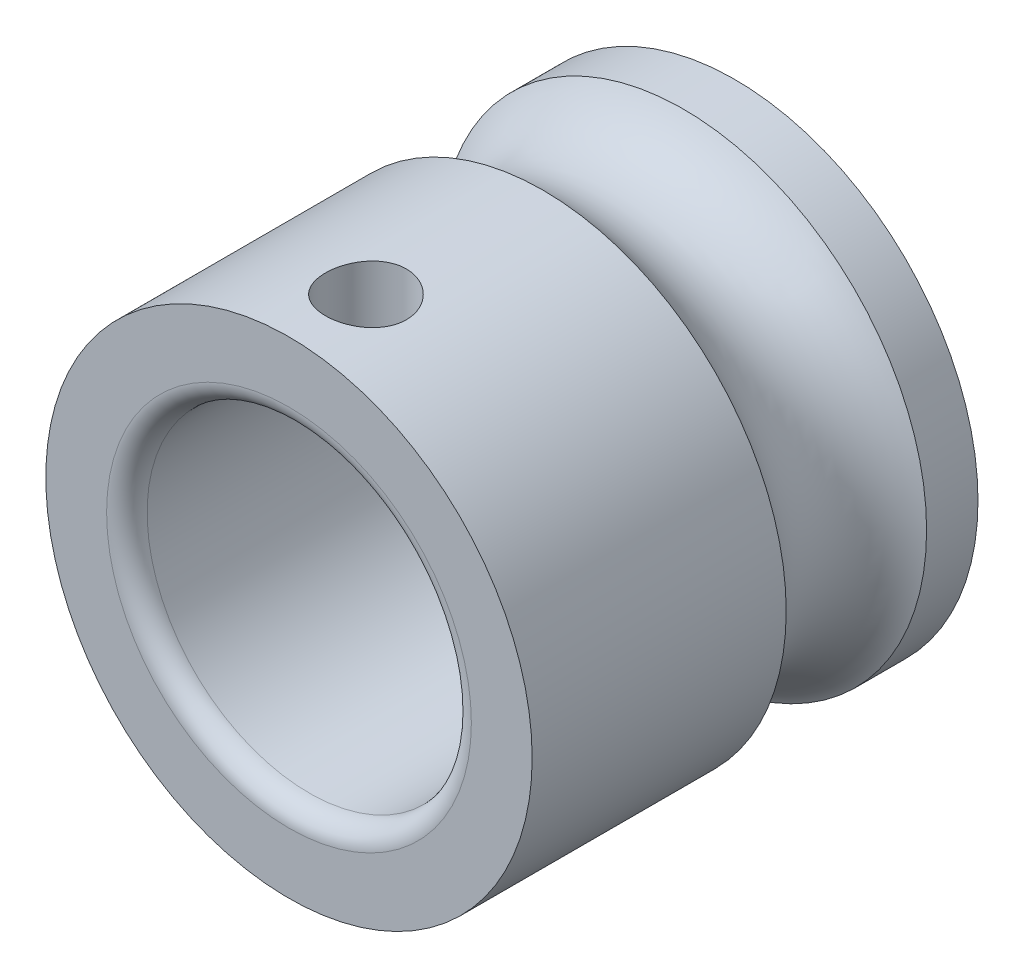
ISO-10303-21;
HEADER;
FILE_DESCRIPTION(('STEP AP214'),'2;1');
FILE_NAME('part.step','',(''),(''),'','','');
FILE_SCHEMA(('AUTOMOTIVE_DESIGN { 1 0 10303 214 1 1 1 1 }'));
ENDSEC;
DATA;
#1=APPLICATION_CONTEXT('core data for automotive mechanical design processes');
#2=APPLICATION_PROTOCOL_DEFINITION('international standard','automotive_design',2000,#1);
#3=PRODUCT_CONTEXT('',#1,'mechanical');
#4=PRODUCT('Part','Part','',(#3));
#5=PRODUCT_RELATED_PRODUCT_CATEGORY('part','',(#4));
#6=PRODUCT_DEFINITION_FORMATION('','',#4);
#7=PRODUCT_DEFINITION_CONTEXT('part definition',#1,'design');
#8=PRODUCT_DEFINITION('design','',#6,#7);
#9=PRODUCT_DEFINITION_SHAPE('','',#8);
#10=(LENGTH_UNIT() NAMED_UNIT(*) SI_UNIT(.MILLI.,.METRE.));
#11=(NAMED_UNIT(*) PLANE_ANGLE_UNIT() SI_UNIT($,.RADIAN.));
#12=(NAMED_UNIT(*) SI_UNIT($,.STERADIAN.) SOLID_ANGLE_UNIT());
#13=UNCERTAINTY_MEASURE_WITH_UNIT(LENGTH_MEASURE(1.E-05),#10,'distance_accuracy_value','');
#14=(GEOMETRIC_REPRESENTATION_CONTEXT(3) GLOBAL_UNCERTAINTY_ASSIGNED_CONTEXT((#13)) GLOBAL_UNIT_ASSIGNED_CONTEXT((#10,
#11,#12)) REPRESENTATION_CONTEXT('',''));
#15=CARTESIAN_POINT('',(0.,0.,0.));
#16=DIRECTION('',(0.,0.,1.));
#17=DIRECTION('',(1.,0.,0.));
#18=AXIS2_PLACEMENT_3D('',#15,#16,#17);
#19=CARTESIAN_POINT('',(0.,0.,-3.));
#20=DIRECTION('',(0.,0.,1.));
#21=DIRECTION('',(1.,0.,0.));
#22=AXIS2_PLACEMENT_3D('',#19,#20,#21);
#23=CYLINDRICAL_SURFACE('',#22,6.);
#24=CARTESIAN_POINT('',(0.,0.,1.73205080756888));
#25=DIRECTION('',(0.,0.,-1.));
#26=DIRECTION('',(-1.,0.,0.));
#27=AXIS2_PLACEMENT_3D('',#24,#25,#26);
#28=CIRCLE('',#27,6.);
#29=CARTESIAN_POINT('',(-6.,0.,1.73205080756888));
#30=VERTEX_POINT('',#29);
#31=EDGE_CURVE('E72',#30,#30,#28,.T.);
#32=ORIENTED_EDGE('',*,*,#31,.F.);
#33=EDGE_LOOP('',(#32));
#34=FACE_BOUND('',#33,.T.);
#35=CARTESIAN_POINT('',(0.,0.,8.));
#36=DIRECTION('',(0.,0.,1.));
#37=DIRECTION('',(1.,0.,0.));
#38=AXIS2_PLACEMENT_3D('',#35,#36,#37);
#39=CIRCLE('',#38,6.);
#40=CARTESIAN_POINT('',(6.,0.,8.));
#41=VERTEX_POINT('',#40);
#42=EDGE_CURVE('E71',#41,#41,#39,.T.);
#43=ORIENTED_EDGE('',*,*,#42,.F.);
#44=EDGE_LOOP('',(#43));
#45=FACE_BOUND('',#44,.T.);
#46=CARTESIAN_POINT('',(0.,6.,5.10102588848349));
#47=CARTESIAN_POINT('',(0.0557563619832859,5.9999990446753,5.10102812406262));
#48=CARTESIAN_POINT('',(0.111543152735528,5.99921471165214,5.10570479847106));
#49=CARTESIAN_POINT('',(0.221552088669217,5.99616137976555,5.12428015198962));
#50=CARTESIAN_POINT('',(0.275772747183699,5.99389101569556,5.13818731124813));
#51=CARTESIAN_POINT('',(0.381041898885057,5.9881202729458,5.17479206792059));
#52=CARTESIAN_POINT('',(0.43209294737276,5.98462090063677,5.19748247473972));
#53=CARTESIAN_POINT('',(0.529656736791178,5.97677690832828,5.25099080530445));
#54=CARTESIAN_POINT('',(0.576169995951436,5.97243238501774,5.28180779947669));
#55=CARTESIAN_POINT('',(0.663789045716672,5.96333326983325,5.35100792201167));
#56=CARTESIAN_POINT('',(0.704845161413987,5.95857548725943,5.38945353433794));
#57=CARTESIAN_POINT('',(0.779955399463971,5.94921050750693,5.47268507587262));
#58=CARTESIAN_POINT('',(0.814009079756388,5.94460331985067,5.51747140506614));
#59=CARTESIAN_POINT('',(0.874346850242053,5.93603026303912,5.61245427496231));
#60=CARTESIAN_POINT('',(0.900581821144401,5.93206851636655,5.66268242320539));
#61=CARTESIAN_POINT('',(0.944223346164488,5.9252791591787,5.76690971420374));
#62=CARTESIAN_POINT('',(0.961630496626245,5.92245147205723,5.82090860195454));
#63=CARTESIAN_POINT('',(0.986965751113923,5.91828214737102,5.93061799842611));
#64=CARTESIAN_POINT('',(0.994979611654161,5.9169270739428,5.98630818308405));
#65=CARTESIAN_POINT('',(1.00156669011595,5.9158157557466,6.09825799923688));
#66=CARTESIAN_POINT('',(1.0001405761556,5.91605939782886,6.15451759015041));
#67=CARTESIAN_POINT('',(0.987958039358461,5.91810571545422,6.26539703299367));
#68=CARTESIAN_POINT('',(0.977297952755909,5.91989229327567,6.32002780990158));
#69=CARTESIAN_POINT('',(0.947101256161378,5.92479798084403,6.42671441561514));
#70=CARTESIAN_POINT('',(0.927564341727896,5.92791713629309,6.47877015603891));
#71=CARTESIAN_POINT('',(0.880070898437565,5.9351539173364,6.57911741785986));
#72=CARTESIAN_POINT('',(0.852074365551886,5.9392762684293,6.62738965091598));
#73=CARTESIAN_POINT('',(0.788484807022974,5.94805167366004,6.71858764869884));
#74=CARTESIAN_POINT('',(0.752891168261716,5.95270477061714,6.76151298146546));
#75=CARTESIAN_POINT('',(0.674592884863622,5.96208811151914,6.84135632280643));
#76=CARTESIAN_POINT('',(0.631805585549251,5.96681859692661,6.87819329589952));
#77=CARTESIAN_POINT('',(0.540614099592659,5.97577040558689,6.94417699354963));
#78=CARTESIAN_POINT('',(0.492209876762569,5.97999172555898,6.97332366855678));
#79=CARTESIAN_POINT('',(0.391082366466685,5.98745557157165,7.023106779338));
#80=CARTESIAN_POINT('',(0.338355490225865,5.99069727362979,7.04373605621599));
#81=CARTESIAN_POINT('',(0.230119338241093,5.99583001205064,7.07582357458188));
#82=CARTESIAN_POINT('',(0.174610295671788,5.9977211614019,7.08728258327298));
#83=CARTESIAN_POINT('',(0.0630839605206498,5.99992451937074,7.10059443186794));
#84=CARTESIAN_POINT('',(0.0070802948604048,6.00025501205114,7.10255851720573));
#85=CARTESIAN_POINT('',(-0.104455909155955,5.99934989768468,7.09712135071224));
#86=CARTESIAN_POINT('',(-0.159988465556815,5.99811435089647,7.08972045923));
#87=CARTESIAN_POINT('',(-0.268662470218705,5.99422730775281,7.0658559487493));
#88=CARTESIAN_POINT('',(-0.321816347354152,5.99158441920524,7.04944740512744));
#89=CARTESIAN_POINT('',(-0.424618753944177,5.98517785782144,7.00809208120368));
#90=CARTESIAN_POINT('',(-0.474267086363888,5.98141412204808,6.98314482142938));
#91=CARTESIAN_POINT('',(-0.569132275787583,5.97313806520963,6.92516543860478));
#92=CARTESIAN_POINT('',(-0.614306100374859,5.96861942354809,6.89206382601659));
#93=CARTESIAN_POINT('',(-0.698497434201075,5.9593538695676,6.81881096232947));
#94=CARTESIAN_POINT('',(-0.737514495878633,5.95460694068619,6.77865919917282));
#95=CARTESIAN_POINT('',(-0.8086971118632,5.94536070094338,6.69194686925492));
#96=CARTESIAN_POINT('',(-0.840787504445486,5.94086446454842,6.64532422227773));
#97=CARTESIAN_POINT('',(-0.896680924117994,5.93268611911154,6.54728470082808));
#98=CARTESIAN_POINT('',(-0.920484213907929,5.92900398426408,6.49586797839249));
#99=CARTESIAN_POINT('',(-0.95901533258926,5.92289381479082,6.38990999535864));
#100=CARTESIAN_POINT('',(-0.973780573019178,5.92046061724426,6.3353826504713));
#101=CARTESIAN_POINT('',(-0.993934181511311,5.91711086734105,6.22457783679479));
#102=CARTESIAN_POINT('',(-0.999323364778467,5.91619418313089,6.16830052059067));
#103=CARTESIAN_POINT('',(-1.00054914641894,5.91598693233605,6.05634382209853));
#104=CARTESIAN_POINT('',(-0.996504054450075,5.9166762260226,6.00066573705338));
#105=CARTESIAN_POINT('',(-0.979231935582739,5.91955912581491,5.89079418926318));
#106=CARTESIAN_POINT('',(-0.966004938444991,5.92175272704486,5.83660072170674));
#107=CARTESIAN_POINT('',(-0.930789795837961,5.92738942512688,5.73128251356645));
#108=CARTESIAN_POINT('',(-0.908811836240177,5.93083106887868,5.68015428446108));
#109=CARTESIAN_POINT('',(-0.856730801566363,5.93857747568883,5.58229162080555));
#110=CARTESIAN_POINT('',(-0.826627323499425,5.9428822815536,5.53555740433464));
#111=CARTESIAN_POINT('',(-0.758727553748862,5.95193381618249,5.44721165524039));
#112=CARTESIAN_POINT('',(-0.72084422543746,5.95668518230521,5.40566748180338));
#113=CARTESIAN_POINT('',(-0.638643612552093,5.96605748944336,5.32948524669352));
#114=CARTESIAN_POINT('',(-0.594324845165055,5.97067840010619,5.29484878102822));
#115=CARTESIAN_POINT('',(-0.500147667856113,5.97930611856888,5.23324658120351));
#116=CARTESIAN_POINT('',(-0.450253115013128,5.98330846501242,5.20633547275831));
#117=CARTESIAN_POINT('',(-0.346605227751593,5.9902046704071,5.16131809463952));
#118=CARTESIAN_POINT('',(-0.292855797932004,5.99309963270993,5.14320305605161));
#119=CARTESIAN_POINT('',(-0.19908132401816,5.99682316333182,5.12022377883283));
#120=CARTESIAN_POINT('',(-0.159623532119379,5.99800810909344,5.11303610063711));
#121=CARTESIAN_POINT('',(-0.0801157241279235,5.99959686394448,5.10343639334559));
#122=CARTESIAN_POINT('',(-0.0400657182433976,6.00000068648257,5.10102428202855));
#123=CARTESIAN_POINT('',(0.,6.,5.10102588848349));
#124=B_SPLINE_CURVE_WITH_KNOTS('',3,(#46,#47,#48,#49,#50,#51,#52,#53,#54,#55,#56,#57,#58,#59,
#60,#61,#62,#63,#64,#65,#66,#67,#68,#69,#70,#71,#72,#73,#74,#75,#76,#77,#78,#79,#80,#81,#82,#83,
#84,#85,#86,#87,#88,#89,#90,#91,#92,#93,#94,#95,#96,#97,#98,#99,#100,#101,#102,#103,#104,#105,
#106,#107,#108,#109,#110,#111,#112,#113,#114,#115,#116,#117,#118,#119,#120,#121,#122,#123),
.UNSPECIFIED.,.T.,.F.,(4,2,2,2,2,2,2,2,2,2,2,2,2,2,2,2,2,2,2,2,2,2,2,2,2,2,2,2,2,2,2,2,2,2,2,2,
2,2,4),(0.,0.167122633975404,0.334399018278168,0.501538746810108,0.668659365069916,
0.837209964249328,1.00577120067943,1.17537008329536,1.34495750750472,1.51298430841369,
1.68099921728354,1.84728208704163,2.01357066010152,2.18065822653023,2.34775928272229,
2.51693107964531,2.68610396654339,2.85541875566361,3.0247193780846,3.19203153396559,
3.35933725214344,3.52563122802566,3.69193454330427,3.8597073025081,4.02749225221713,
4.19701528803048,4.36653294950377,4.53534408936709,4.70414055114647,4.8708316380908,
5.03752218475253,5.20401927290489,5.37052462011734,5.53900553677357,5.70752533551589,
5.8772089264288,6.04672300852029,6.16681699265607,6.28690890910787),.UNSPECIFIED.);
#125=CARTESIAN_POINT('',(0.,6.,5.10102588848349));
#126=VERTEX_POINT('',#125);
#127=EDGE_CURVE('E76',#126,#126,#124,.T.);
#128=ORIENTED_EDGE('',*,*,#127,.T.);
#129=EDGE_LOOP('',(#128));
#130=FACE_BOUND('',#129,.T.);
#131=ADVANCED_FACE('F37',(#34,#45,#130),#23,.T.);
#132=CARTESIAN_POINT('',(0.,0.,-3.));
#133=DIRECTION('',(0.,0.,1.));
#134=DIRECTION('',(1.,0.,0.));
#135=AXIS2_PLACEMENT_3D('',#132,#133,#134);
#136=CYLINDRICAL_SURFACE('',#135,4.);
#137=CARTESIAN_POINT('',(0.,0.,7.5));
#138=DIRECTION('',(0.,0.,1.));
#139=DIRECTION('',(1.,0.,0.));
#140=AXIS2_PLACEMENT_3D('',#137,#138,#139);
#141=CIRCLE('',#140,4.);
#142=CARTESIAN_POINT('',(4.,0.,7.5));
#143=VERTEX_POINT('',#142);
#144=EDGE_CURVE('E56',#143,#143,#141,.T.);
#145=ORIENTED_EDGE('',*,*,#144,.T.);
#146=EDGE_LOOP('',(#145));
#147=FACE_BOUND('',#146,.T.);
#148=CARTESIAN_POINT('',(0.,0.,-2.5));
#149=DIRECTION('',(0.,0.,1.));
#150=DIRECTION('',(1.,0.,0.));
#151=AXIS2_PLACEMENT_3D('',#148,#149,#150);
#152=CIRCLE('',#151,4.);
#153=CARTESIAN_POINT('',(4.,0.,-2.5));
#154=VERTEX_POINT('',#153);
#155=EDGE_CURVE('E62',#154,#154,#152,.F.);
#156=ORIENTED_EDGE('',*,*,#155,.T.);
#157=EDGE_LOOP('',(#156));
#158=FACE_BOUND('',#157,.T.);
#159=CARTESIAN_POINT('',(0.,4.,5.10102588848349));
#160=CARTESIAN_POINT('',(0.0552507257798207,3.99999906578675,5.1010274389756));
#161=CARTESIAN_POINT('',(0.110518771887175,3.99884385421219,5.10562025566602));
#162=CARTESIAN_POINT('',(0.219470882513688,3.99434742553261,5.12384265602149));
#163=CARTESIAN_POINT('',(0.273154031247159,3.99100496946645,5.13747736150872));
#164=CARTESIAN_POINT('',(0.377347248121718,3.98250417554693,5.17331872412488));
#165=CARTESIAN_POINT('',(0.427861042286669,3.97734801894724,5.19551508762701));
#166=CARTESIAN_POINT('',(0.524448087936285,3.96576895871729,5.24781348184671));
#167=CARTESIAN_POINT('',(0.57052118956584,3.95934601236034,5.27791577922945));
#168=CARTESIAN_POINT('',(0.657867951533946,3.94578275727867,5.34582641491963));
#169=CARTESIAN_POINT('',(0.699037126707381,3.93863138099022,5.38376693845628));
#170=CARTESIAN_POINT('',(0.774499284802203,3.92449080078353,5.46599402508944));
#171=CARTESIAN_POINT('',(0.808791491299423,3.91750161525565,5.51028130378115));
#172=CARTESIAN_POINT('',(0.870017695199355,3.9043651713314,5.60475603964178));
#173=CARTESIAN_POINT('',(0.896834810616904,3.89823196313737,5.65502137569043));
#174=CARTESIAN_POINT('',(0.941597939033684,3.88766329874815,5.75952482958906));
#175=CARTESIAN_POINT('',(0.959545370292888,3.88322757115192,5.81376231070066));
#176=CARTESIAN_POINT('',(0.985703224536193,3.87666984478367,5.92352155395181));
#177=CARTESIAN_POINT('',(0.994101512222225,3.87450327383617,5.97899581918336));
#178=CARTESIAN_POINT('',(1.00150785004523,3.87259575025161,6.09060493449281));
#179=CARTESIAN_POINT('',(1.00051742787865,3.87285440299096,6.1467396756159));
#180=CARTESIAN_POINT('',(0.989324349759521,3.87572803664412,6.25663642697981));
#181=CARTESIAN_POINT('',(0.979345560127013,3.87828575334586,6.31042296946022));
#182=CARTESIAN_POINT('',(0.950816124602071,3.88537806450989,6.41553325575769));
#183=CARTESIAN_POINT('',(0.932264868046283,3.88991279980464,6.46685682383615));
#184=CARTESIAN_POINT('',(0.88692631862477,3.90050075936124,6.56618456598487));
#185=CARTESIAN_POINT('',(0.860057778155274,3.90656884979614,6.61415000300986));
#186=CARTESIAN_POINT('',(0.79890418400997,3.91953140564257,6.70497169498805));
#187=CARTESIAN_POINT('',(0.764617832539227,3.9264260155649,6.74782705386166));
#188=CARTESIAN_POINT('',(0.688442283120812,3.94050587026521,6.82849496561309));
#189=CARTESIAN_POINT('',(0.646364172110574,3.94769379651981,6.86612888185772));
#190=CARTESIAN_POINT('',(0.556407945002467,3.96137310385857,6.93384005012609));
#191=CARTESIAN_POINT('',(0.508529651805296,3.96786446366277,6.96391707132587));
#192=CARTESIAN_POINT('',(0.408077259120928,3.97945154729455,7.01572627929975));
#193=CARTESIAN_POINT('',(0.355487595472416,3.9845424008515,7.03742944865311));
#194=CARTESIAN_POINT('',(0.247250672095255,3.99271944660945,7.07163742562321));
#195=CARTESIAN_POINT('',(0.191603999433657,3.99580602226187,7.08414399276225));
#196=CARTESIAN_POINT('',(0.080359980260018,3.9995699951425,7.09933093218938));
#197=CARTESIAN_POINT('',(0.0247978133254734,4.00030702338852,7.10225457253369));
#198=CARTESIAN_POINT('',(-0.0860219165343385,3.999458698763,7.09885988711317));
#199=CARTESIAN_POINT('',(-0.14127950642973,3.99787355494564,7.09254239328407));
#200=CARTESIAN_POINT('',(-0.249076179184328,3.99259720751571,7.07104528288924));
#201=CARTESIAN_POINT('',(-0.301643412645836,3.98893756123874,7.05599837949883));
#202=CARTESIAN_POINT('',(-0.403504861635008,3.97992471089423,7.01762116579786));
#203=CARTESIAN_POINT('',(-0.452798746021756,3.97457133579928,6.99429001894138));
#204=CARTESIAN_POINT('',(-0.547682089619898,3.96262205284207,6.93953513590034));
#205=CARTESIAN_POINT('',(-0.59319029455722,3.95600578244621,6.90797514688565));
#206=CARTESIAN_POINT('',(-0.678351075762164,3.94229672791613,6.83783261595218));
#207=CARTESIAN_POINT('',(-0.718002639315338,3.93520386167803,6.79924886207222));
#208=CARTESIAN_POINT('',(-0.79132704538182,3.92112637973847,6.71502458125385));
#209=CARTESIAN_POINT('',(-0.824829245081355,3.91414869458187,6.66923408648188));
#210=CARTESIAN_POINT('',(-0.883673839341798,3.90128585584826,6.57253746550635));
#211=CARTESIAN_POINT('',(-0.909016596105291,3.89540065378017,6.52163156651032));
#212=CARTESIAN_POINT('',(-0.950634280406195,3.88545396489777,6.41642207354144));
#213=CARTESIAN_POINT('',(-0.96696293110271,3.88138170194604,6.36214080292082));
#214=CARTESIAN_POINT('',(-0.990230439969186,3.87551162726789,6.25148612989075));
#215=CARTESIAN_POINT('',(-0.997171351652438,3.87371331813291,6.19511318779516));
#216=CARTESIAN_POINT('',(-1.00135906022266,3.87263267469304,6.08361187258002));
#217=CARTESIAN_POINT('',(-0.998878598520078,3.87327955152176,6.028494265067));
#218=CARTESIAN_POINT('',(-0.984918185541911,3.87685272671895,5.91948996270484));
#219=CARTESIAN_POINT('',(-0.973438415124512,3.87977897927904,5.86560324314106));
#220=CARTESIAN_POINT('',(-0.941954212961863,3.88754173788482,5.76088691577322));
#221=CARTESIAN_POINT('',(-0.922000936453583,3.89236676824206,5.71004101832335));
#222=CARTESIAN_POINT('',(-0.874176609070047,3.90338503816552,5.6123823000077));
#223=CARTESIAN_POINT('',(-0.846304460022792,3.90957846747182,5.56557003969221));
#224=CARTESIAN_POINT('',(-0.782578499091423,3.92283756175675,5.47598946914881));
#225=CARTESIAN_POINT('',(-0.746535441941502,3.92992176554505,5.43335850620085));
#226=CARTESIAN_POINT('',(-0.667859580793156,3.94405351497524,5.35466119195322));
#227=CARTESIAN_POINT('',(-0.625225214174096,3.95110105151373,5.31859640174151));
#228=CARTESIAN_POINT('',(-0.533645057801726,3.96451770431775,5.25341834944042));
#229=CARTESIAN_POINT('',(-0.484598948210924,3.97087222243912,5.22444281270244));
#230=CARTESIAN_POINT('',(-0.382177373006983,3.98203283316745,5.17519424652314));
#231=CARTESIAN_POINT('',(-0.328805042291159,3.98684003466521,5.15491498138447));
#232=CARTESIAN_POINT('',(-0.229606835495647,3.99365373043694,5.12664466826372));
#233=CARTESIAN_POINT('',(-0.184253447272045,3.9960172336846,5.11705839311454));
#234=CARTESIAN_POINT('',(-0.0926040476908554,3.99919070154632,5.10424859273553));
#235=CARTESIAN_POINT('',(-0.0463081074950775,4.00000078300596,5.10102458894662));
#236=CARTESIAN_POINT('',(0.,4.,5.10102588848349));
#237=B_SPLINE_CURVE_WITH_KNOTS('',3,(#159,#160,#161,#162,#163,#164,#165,#166,#167,#168,#169,
#170,#171,#172,#173,#174,#175,#176,#177,#178,#179,#180,#181,#182,#183,#184,#185,#186,#187,#188,
#189,#190,#191,#192,#193,#194,#195,#196,#197,#198,#199,#200,#201,#202,#203,#204,#205,#206,#207,
#208,#209,#210,#211,#212,#213,#214,#215,#216,#217,#218,#219,#220,#221,#222,#223,#224,#225,#226,
#227,#228,#229,#230,#231,#232,#233,#234,#235,#236),.UNSPECIFIED.,.T.,.F.,(4,2,2,2,2,2,2,2,2,2,2,
2,2,2,2,2,2,2,2,2,2,2,2,2,2,2,2,2,2,2,2,2,2,2,2,2,2,2,4),(0.,0.16558247498126,0.331258825175933,
0.496736601524071,0.662219960112885,0.830762902914259,0.999324863867078,1.17039098363871,
1.34142974112912,1.50904196732954,1.67662692075131,1.84014998004679,2.00368468977359,
2.16887018582586,2.33408460557442,2.50401000646013,2.67394059705498,2.84445486006076,
3.01493649125762,3.18105539299517,3.34715934075162,3.51080183009358,3.67446084881527,
3.84102391710235,4.00761575338679,4.17829672802984,4.34897012499672,4.51861503076024,
4.68822282168272,4.85295853599075,5.01769093970689,5.18144267039631,5.34521712091268,
5.51326384273273,5.68135046513612,5.85248123666392,6.02348909214233,6.16228161961433,
6.3010637069536),.UNSPECIFIED.);
#238=CARTESIAN_POINT('',(0.,4.,5.10102588848349));
#239=VERTEX_POINT('',#238);
#240=EDGE_CURVE('E41',#239,#239,#237,.T.);
#241=ORIENTED_EDGE('',*,*,#240,.F.);
#242=EDGE_LOOP('',(#241));
#243=FACE_BOUND('',#242,.T.);
#244=ADVANCED_FACE('F106',(#147,#158,#243),#136,.F.);
#245=CARTESIAN_POINT('',(0.,0.,-1.73205080756888));
#246=DIRECTION('',(0.,0.,1.));
#247=DIRECTION('',(1.,0.,0.));
#248=AXIS2_PLACEMENT_3D('',#245,#246,#247);
#249=CIRCLE('',#248,6.);
#250=CARTESIAN_POINT('',(6.,0.,-1.73205080756888));
#251=VERTEX_POINT('',#250);
#252=EDGE_CURVE('E67',#251,#251,#249,.T.);
#253=ORIENTED_EDGE('',*,*,#252,.F.);
#254=EDGE_LOOP('',(#253));
#255=FACE_BOUND('',#254,.T.);
#256=CARTESIAN_POINT('',(0.,0.,-3.));
#257=DIRECTION('',(0.,0.,1.));
#258=DIRECTION('',(1.,0.,0.));
#259=AXIS2_PLACEMENT_3D('',#256,#257,#258);
#260=CIRCLE('',#259,6.);
#261=CARTESIAN_POINT('',(6.,0.,-3.));
#262=VERTEX_POINT('',#261);
#263=EDGE_CURVE('E66',#262,#262,#260,.T.);
#264=ORIENTED_EDGE('',*,*,#263,.T.);
#265=EDGE_LOOP('',(#264));
#266=FACE_BOUND('',#265,.T.);
#267=ADVANCED_FACE('F109',(#255,#266),#23,.T.);
#268=CARTESIAN_POINT('',(0.,0.,-3.));
#269=DIRECTION('',(0.,0.,1.));
#270=DIRECTION('',(1.,0.,0.));
#271=AXIS2_PLACEMENT_3D('',#268,#269,#270);
#272=PLANE('',#271);
#273=CARTESIAN_POINT('',(0.,0.,-3.));
#274=DIRECTION('',(0.,0.,1.));
#275=DIRECTION('',(1.,0.,0.));
#276=AXIS2_PLACEMENT_3D('',#273,#274,#275);
#277=CIRCLE('',#276,4.5);
#278=CARTESIAN_POINT('',(4.5,0.,-3.));
#279=VERTEX_POINT('',#278);
#280=EDGE_CURVE('E10',#279,#279,#277,.T.);
#281=ORIENTED_EDGE('',*,*,#280,.T.);
#282=EDGE_LOOP('',(#281));
#283=FACE_BOUND('',#282,.T.);
#284=ORIENTED_EDGE('',*,*,#263,.F.);
#285=EDGE_LOOP('',(#284));
#286=FACE_BOUND('',#285,.T.);
#287=ADVANCED_FACE('F104',(#283,#286),#272,.F.);
#288=CARTESIAN_POINT('',(0.,0.,8.));
#289=DIRECTION('',(0.,0.,1.));
#290=DIRECTION('',(1.,0.,0.));
#291=AXIS2_PLACEMENT_3D('',#288,#289,#290);
#292=PLANE('',#291);
#293=CARTESIAN_POINT('',(0.,0.,8.));
#294=DIRECTION('',(0.,0.,1.));
#295=DIRECTION('',(1.,0.,0.));
#296=AXIS2_PLACEMENT_3D('',#293,#294,#295);
#297=CIRCLE('',#296,4.5);
#298=CARTESIAN_POINT('',(4.5,0.,8.));
#299=VERTEX_POINT('',#298);
#300=EDGE_CURVE('E51',#299,#299,#297,.F.);
#301=ORIENTED_EDGE('',*,*,#300,.T.);
#302=EDGE_LOOP('',(#301));
#303=FACE_BOUND('',#302,.T.);
#304=ORIENTED_EDGE('',*,*,#42,.T.);
#305=EDGE_LOOP('',(#304));
#306=FACE_BOUND('',#305,.T.);
#307=ADVANCED_FACE('F101',(#303,#306),#292,.T.);
#308=CARTESIAN_POINT('',(0.,0.,0.));
#309=DIRECTION('',(0.,0.,-1.));
#310=DIRECTION('',(-1.,0.,0.));
#311=AXIS2_PLACEMENT_3D('',#308,#309,#310);
#312=TOROIDAL_SURFACE('',#311,7.,2.);
#313=ORIENTED_EDGE('',*,*,#252,.T.);
#314=EDGE_LOOP('',(#313));
#315=FACE_BOUND('',#314,.T.);
#316=ORIENTED_EDGE('',*,*,#31,.T.);
#317=EDGE_LOOP('',(#316));
#318=FACE_BOUND('',#317,.T.);
#319=ADVANCED_FACE('F96',(#315,#318),#312,.F.);
#320=CARTESIAN_POINT('',(0.,0.,7.5));
#321=DIRECTION('',(0.,0.,1.));
#322=DIRECTION('',(1.,0.,0.));
#323=AXIS2_PLACEMENT_3D('',#320,#321,#322);
#324=TOROIDAL_SURFACE('',#323,4.5,0.5);
#325=ORIENTED_EDGE('',*,*,#300,.F.);
#326=EDGE_LOOP('',(#325));
#327=FACE_BOUND('',#326,.T.);
#328=ORIENTED_EDGE('',*,*,#144,.F.);
#329=EDGE_LOOP('',(#328));
#330=FACE_BOUND('',#329,.T.);
#331=ADVANCED_FACE('F100',(#327,#330),#324,.T.);
#332=CARTESIAN_POINT('',(0.,0.,-2.5));
#333=DIRECTION('',(0.,0.,1.));
#334=DIRECTION('',(1.,0.,0.));
#335=AXIS2_PLACEMENT_3D('',#332,#333,#334);
#336=TOROIDAL_SURFACE('',#335,4.5,0.5);
#337=ORIENTED_EDGE('',*,*,#155,.F.);
#338=EDGE_LOOP('',(#337));
#339=FACE_BOUND('',#338,.T.);
#340=ORIENTED_EDGE('',*,*,#280,.F.);
#341=EDGE_LOOP('',(#340));
#342=FACE_BOUND('',#341,.T.);
#343=ADVANCED_FACE('F39',(#339,#342),#336,.T.);
#344=CARTESIAN_POINT('',(0.,6.,6.10102588848349));
#345=DIRECTION('',(0.,-1.,0.));
#346=DIRECTION('',(0.,0.,-1.));
#347=AXIS2_PLACEMENT_3D('',#344,#345,#346);
#348=CYLINDRICAL_SURFACE('',#347,1.);
#349=ORIENTED_EDGE('',*,*,#127,.F.);
#350=EDGE_LOOP('',(#349));
#351=FACE_BOUND('',#350,.T.);
#352=ORIENTED_EDGE('',*,*,#240,.T.);
#353=EDGE_LOOP('',(#352));
#354=FACE_BOUND('',#353,.T.);
#355=ADVANCED_FACE('F91',(#351,#354),#348,.F.);
#356=CLOSED_SHELL('',(#131,#244,#267,#287,#307,#319,#331,#343,#355));
#357=MANIFOLD_SOLID_BREP('B2',#356);
#358=ADVANCED_BREP_SHAPE_REPRESENTATION('',(#18,#357),#14);
#359=SHAPE_DEFINITION_REPRESENTATION(#9,#358);
ENDSEC;
END-ISO-10303-21;
